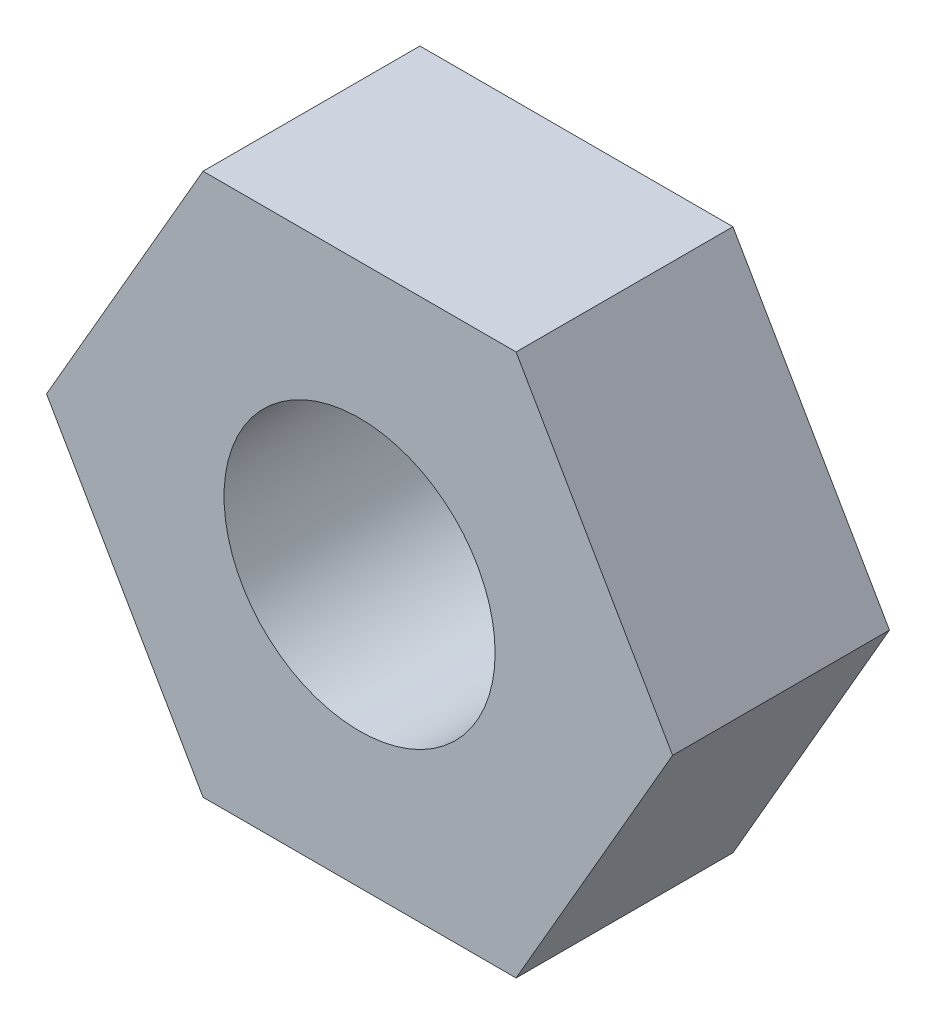
ISO-10303-21;
HEADER;
FILE_DESCRIPTION(('STEP AP214'),'2;1');
FILE_NAME('part.step','',(''),(''),'','','');
FILE_SCHEMA(('AUTOMOTIVE_DESIGN { 1 0 10303 214 1 1 1 1 }'));
ENDSEC;
DATA;
#1=APPLICATION_CONTEXT('core data for automotive mechanical design processes');
#2=APPLICATION_PROTOCOL_DEFINITION('international standard','automotive_design',2000,#1);
#3=PRODUCT_CONTEXT('',#1,'mechanical');
#4=PRODUCT('Part','Part','',(#3));
#5=PRODUCT_RELATED_PRODUCT_CATEGORY('part','',(#4));
#6=PRODUCT_DEFINITION_FORMATION('','',#4);
#7=PRODUCT_DEFINITION_CONTEXT('part definition',#1,'design');
#8=PRODUCT_DEFINITION('design','',#6,#7);
#9=PRODUCT_DEFINITION_SHAPE('','',#8);
#10=(LENGTH_UNIT() NAMED_UNIT(*) SI_UNIT(.MILLI.,.METRE.));
#11=(NAMED_UNIT(*) PLANE_ANGLE_UNIT() SI_UNIT($,.RADIAN.));
#12=(NAMED_UNIT(*) SI_UNIT($,.STERADIAN.) SOLID_ANGLE_UNIT());
#13=UNCERTAINTY_MEASURE_WITH_UNIT(LENGTH_MEASURE(1.E-05),#10,'distance_accuracy_value','');
#14=(GEOMETRIC_REPRESENTATION_CONTEXT(3) GLOBAL_UNCERTAINTY_ASSIGNED_CONTEXT((#13)) GLOBAL_UNIT_ASSIGNED_CONTEXT((#10,
#11,#12)) REPRESENTATION_CONTEXT('',''));
#15=CARTESIAN_POINT('',(0.,0.,0.));
#16=DIRECTION('',(0.,0.,1.));
#17=DIRECTION('',(1.,0.,0.));
#18=AXIS2_PLACEMENT_3D('',#15,#16,#17);
#19=CARTESIAN_POINT('',(0.,0.,1.6));
#20=DIRECTION('',(0.,0.,1.));
#21=DIRECTION('',(1.,0.,0.));
#22=AXIS2_PLACEMENT_3D('',#19,#20,#21);
#23=PLANE('',#22);
#24=DIRECTION('',(0.5,0.866025403784439,0.));
#25=VECTOR('',#24,1.);
#26=CARTESIAN_POINT('',(1.15470053837925,-2.,1.6));
#27=LINE('',#26,#25);
#28=CARTESIAN_POINT('',(1.15470053837925,-2.,1.6));
#29=VERTEX_POINT('',#28);
#30=CARTESIAN_POINT('',(2.3094010767585,0.,1.6));
#31=VERTEX_POINT('',#30);
#32=EDGE_CURVE('E140',#29,#31,#27,.T.);
#33=ORIENTED_EDGE('',*,*,#32,.T.);
#34=DIRECTION('',(-0.5,0.866025403784439,0.));
#35=VECTOR('',#34,1.);
#36=CARTESIAN_POINT('',(2.3094010767585,0.,1.6));
#37=LINE('',#36,#35);
#38=CARTESIAN_POINT('',(1.15470053837925,2.,1.6));
#39=VERTEX_POINT('',#38);
#40=EDGE_CURVE('E93',#31,#39,#37,.T.);
#41=ORIENTED_EDGE('',*,*,#40,.T.);
#42=DIRECTION('',(-1.,0.,0.));
#43=VECTOR('',#42,1.);
#44=CARTESIAN_POINT('',(1.15470053837925,2.,1.6));
#45=LINE('',#44,#43);
#46=CARTESIAN_POINT('',(-1.15470053837925,2.,1.6));
#47=VERTEX_POINT('',#46);
#48=EDGE_CURVE('E108',#39,#47,#45,.T.);
#49=ORIENTED_EDGE('',*,*,#48,.T.);
#50=DIRECTION('',(-0.5,-0.866025403784438,0.));
#51=VECTOR('',#50,1.);
#52=CARTESIAN_POINT('',(-1.15470053837925,2.,1.6));
#53=LINE('',#52,#51);
#54=CARTESIAN_POINT('',(-2.3094010767585,0.,1.6));
#55=VERTEX_POINT('',#54);
#56=EDGE_CURVE('E105',#47,#55,#53,.T.);
#57=ORIENTED_EDGE('',*,*,#56,.T.);
#58=DIRECTION('',(0.5,-0.866025403784439,0.));
#59=VECTOR('',#58,1.);
#60=CARTESIAN_POINT('',(-2.3094010767585,0.,1.6));
#61=LINE('',#60,#59);
#62=CARTESIAN_POINT('',(-1.15470053837925,-2.,1.6));
#63=VERTEX_POINT('',#62);
#64=EDGE_CURVE('E106',#55,#63,#61,.T.);
#65=ORIENTED_EDGE('',*,*,#64,.T.);
#66=DIRECTION('',(1.,0.,0.));
#67=VECTOR('',#66,1.);
#68=CARTESIAN_POINT('',(-1.15470053837925,-2.,1.6));
#69=LINE('',#68,#67);
#70=EDGE_CURVE('E59',#63,#29,#69,.T.);
#71=ORIENTED_EDGE('',*,*,#70,.T.);
#72=EDGE_LOOP('',(#33,#41,#49,#57,#65,#71));
#73=FACE_BOUND('',#72,.T.);
#74=CARTESIAN_POINT('',(0.,0.,1.6));
#75=DIRECTION('',(0.,0.,1.));
#76=DIRECTION('',(1.,0.,0.));
#77=AXIS2_PLACEMENT_3D('',#74,#75,#76);
#78=CIRCLE('',#77,1.);
#79=CARTESIAN_POINT('',(1.,0.,1.6));
#80=VERTEX_POINT('',#79);
#81=EDGE_CURVE('E129',#80,#80,#78,.T.);
#82=ORIENTED_EDGE('',*,*,#81,.F.);
#83=EDGE_LOOP('',(#82));
#84=FACE_BOUND('',#83,.T.);
#85=ADVANCED_FACE('F41',(#73,#84),#23,.T.);
#86=CARTESIAN_POINT('',(0.,0.,0.));
#87=DIRECTION('',(0.,0.,1.));
#88=DIRECTION('',(1.,0.,0.));
#89=AXIS2_PLACEMENT_3D('',#86,#87,#88);
#90=PLANE('',#89);
#91=DIRECTION('',(0.5,0.866025403784439,0.));
#92=VECTOR('',#91,1.);
#93=CARTESIAN_POINT('',(1.15470053837925,-2.,0.));
#94=LINE('',#93,#92);
#95=CARTESIAN_POINT('',(1.15470053837925,-2.,0.));
#96=VERTEX_POINT('',#95);
#97=CARTESIAN_POINT('',(2.3094010767585,0.,0.));
#98=VERTEX_POINT('',#97);
#99=EDGE_CURVE('E126',#96,#98,#94,.T.);
#100=ORIENTED_EDGE('',*,*,#99,.F.);
#101=DIRECTION('',(1.,0.,0.));
#102=VECTOR('',#101,1.);
#103=CARTESIAN_POINT('',(-1.15470053837925,-2.,0.));
#104=LINE('',#103,#102);
#105=CARTESIAN_POINT('',(-1.15470053837925,-2.,0.));
#106=VERTEX_POINT('',#105);
#107=EDGE_CURVE('E89',#106,#96,#104,.T.);
#108=ORIENTED_EDGE('',*,*,#107,.F.);
#109=DIRECTION('',(0.5,-0.866025403784439,0.));
#110=VECTOR('',#109,1.);
#111=CARTESIAN_POINT('',(-2.3094010767585,0.,0.));
#112=LINE('',#111,#110);
#113=CARTESIAN_POINT('',(-2.3094010767585,0.,0.));
#114=VERTEX_POINT('',#113);
#115=EDGE_CURVE('E81',#114,#106,#112,.T.);
#116=ORIENTED_EDGE('',*,*,#115,.F.);
#117=DIRECTION('',(-0.5,-0.866025403784438,0.));
#118=VECTOR('',#117,1.);
#119=CARTESIAN_POINT('',(-1.15470053837925,2.,0.));
#120=LINE('',#119,#118);
#121=CARTESIAN_POINT('',(-1.15470053837925,2.,0.));
#122=VERTEX_POINT('',#121);
#123=EDGE_CURVE('E116',#122,#114,#120,.T.);
#124=ORIENTED_EDGE('',*,*,#123,.F.);
#125=DIRECTION('',(-1.,0.,0.));
#126=VECTOR('',#125,1.);
#127=CARTESIAN_POINT('',(1.15470053837925,2.,0.));
#128=LINE('',#127,#126);
#129=CARTESIAN_POINT('',(1.15470053837925,2.,0.));
#130=VERTEX_POINT('',#129);
#131=EDGE_CURVE('E134',#130,#122,#128,.T.);
#132=ORIENTED_EDGE('',*,*,#131,.F.);
#133=DIRECTION('',(-0.5,0.866025403784439,0.));
#134=VECTOR('',#133,1.);
#135=CARTESIAN_POINT('',(2.3094010767585,0.,0.));
#136=LINE('',#135,#134);
#137=EDGE_CURVE('E128',#98,#130,#136,.T.);
#138=ORIENTED_EDGE('',*,*,#137,.F.);
#139=EDGE_LOOP('',(#100,#108,#116,#124,#132,#138));
#140=FACE_BOUND('',#139,.T.);
#141=CARTESIAN_POINT('',(0.,0.,0.));
#142=DIRECTION('',(0.,0.,1.));
#143=DIRECTION('',(1.,0.,0.));
#144=AXIS2_PLACEMENT_3D('',#141,#142,#143);
#145=CIRCLE('',#144,1.);
#146=CARTESIAN_POINT('',(1.,0.,0.));
#147=VERTEX_POINT('',#146);
#148=EDGE_CURVE('E229',#147,#147,#145,.T.);
#149=ORIENTED_EDGE('',*,*,#148,.T.);
#150=EDGE_LOOP('',(#149));
#151=FACE_BOUND('',#150,.T.);
#152=ADVANCED_FACE('F146',(#140,#151),#90,.F.);
#153=CARTESIAN_POINT('',(1.15470053837925,-2.,1.6));
#154=DIRECTION('',(-0.866025403784439,0.5,0.));
#155=DIRECTION('',(-0.5,-0.866025403784439,0.));
#156=AXIS2_PLACEMENT_3D('',#153,#154,#155);
#157=PLANE('',#156);
#158=ORIENTED_EDGE('',*,*,#99,.T.);
#159=DIRECTION('',(0.,0.,-1.));
#160=VECTOR('',#159,1.);
#161=CARTESIAN_POINT('',(2.3094010767585,0.,1.6));
#162=LINE('',#161,#160);
#163=EDGE_CURVE('E11',#31,#98,#162,.T.);
#164=ORIENTED_EDGE('',*,*,#163,.F.);
#165=ORIENTED_EDGE('',*,*,#32,.F.);
#166=DIRECTION('',(0.,0.,-1.));
#167=VECTOR('',#166,1.);
#168=CARTESIAN_POINT('',(1.15470053837925,-2.,1.6));
#169=LINE('',#168,#167);
#170=EDGE_CURVE('E125',#29,#96,#169,.T.);
#171=ORIENTED_EDGE('',*,*,#170,.T.);
#172=EDGE_LOOP('',(#158,#164,#165,#171));
#173=FACE_BOUND('',#172,.T.);
#174=ADVANCED_FACE('F43',(#173),#157,.F.);
#175=CARTESIAN_POINT('',(2.3094010767585,0.,1.6));
#176=DIRECTION('',(-0.866025403784439,-0.5,0.));
#177=DIRECTION('',(0.5,-0.866025403784439,0.));
#178=AXIS2_PLACEMENT_3D('',#175,#176,#177);
#179=PLANE('',#178);
#180=ORIENTED_EDGE('',*,*,#137,.T.);
#181=DIRECTION('',(0.,0.,-1.));
#182=VECTOR('',#181,1.);
#183=CARTESIAN_POINT('',(1.15470053837925,2.,1.6));
#184=LINE('',#183,#182);
#185=EDGE_CURVE('E49',#39,#130,#184,.T.);
#186=ORIENTED_EDGE('',*,*,#185,.F.);
#187=ORIENTED_EDGE('',*,*,#40,.F.);
#188=ORIENTED_EDGE('',*,*,#163,.T.);
#189=EDGE_LOOP('',(#180,#186,#187,#188));
#190=FACE_BOUND('',#189,.T.);
#191=ADVANCED_FACE('F171',(#190),#179,.F.);
#192=CARTESIAN_POINT('',(1.15470053837925,2.,1.6));
#193=DIRECTION('',(0.,-1.,0.));
#194=DIRECTION('',(0.,0.,-1.));
#195=AXIS2_PLACEMENT_3D('',#192,#193,#194);
#196=PLANE('',#195);
#197=ORIENTED_EDGE('',*,*,#131,.T.);
#198=DIRECTION('',(0.,0.,-1.));
#199=VECTOR('',#198,1.);
#200=CARTESIAN_POINT('',(-1.15470053837925,2.,1.6));
#201=LINE('',#200,#199);
#202=EDGE_CURVE('E120',#47,#122,#201,.T.);
#203=ORIENTED_EDGE('',*,*,#202,.F.);
#204=ORIENTED_EDGE('',*,*,#48,.F.);
#205=ORIENTED_EDGE('',*,*,#185,.T.);
#206=EDGE_LOOP('',(#197,#203,#204,#205));
#207=FACE_BOUND('',#206,.T.);
#208=ADVANCED_FACE('F141',(#207),#196,.F.);
#209=CARTESIAN_POINT('',(-1.15470053837925,2.,1.6));
#210=DIRECTION('',(0.866025403784438,-0.5,0.));
#211=DIRECTION('',(0.5,0.866025403784439,0.));
#212=AXIS2_PLACEMENT_3D('',#209,#210,#211);
#213=PLANE('',#212);
#214=ORIENTED_EDGE('',*,*,#123,.T.);
#215=DIRECTION('',(0.,0.,-1.));
#216=VECTOR('',#215,1.);
#217=CARTESIAN_POINT('',(-2.3094010767585,0.,1.6));
#218=LINE('',#217,#216);
#219=EDGE_CURVE('E113',#55,#114,#218,.T.);
#220=ORIENTED_EDGE('',*,*,#219,.F.);
#221=ORIENTED_EDGE('',*,*,#56,.F.);
#222=ORIENTED_EDGE('',*,*,#202,.T.);
#223=EDGE_LOOP('',(#214,#220,#221,#222));
#224=FACE_BOUND('',#223,.T.);
#225=ADVANCED_FACE('F112',(#224),#213,.F.);
#226=CARTESIAN_POINT('',(-2.3094010767585,0.,1.6));
#227=DIRECTION('',(0.866025403784439,0.5,0.));
#228=DIRECTION('',(-0.5,0.866025403784439,0.));
#229=AXIS2_PLACEMENT_3D('',#226,#227,#228);
#230=PLANE('',#229);
#231=ORIENTED_EDGE('',*,*,#115,.T.);
#232=DIRECTION('',(0.,0.,-1.));
#233=VECTOR('',#232,1.);
#234=CARTESIAN_POINT('',(-1.15470053837925,-2.,1.6));
#235=LINE('',#234,#233);
#236=EDGE_CURVE('E117',#63,#106,#235,.T.);
#237=ORIENTED_EDGE('',*,*,#236,.F.);
#238=ORIENTED_EDGE('',*,*,#64,.F.);
#239=ORIENTED_EDGE('',*,*,#219,.T.);
#240=EDGE_LOOP('',(#231,#237,#238,#239));
#241=FACE_BOUND('',#240,.T.);
#242=ADVANCED_FACE('F119',(#241),#230,.F.);
#243=CARTESIAN_POINT('',(-1.15470053837925,-2.,1.6));
#244=DIRECTION('',(0.,1.,0.));
#245=DIRECTION('',(-1.,0.,0.));
#246=AXIS2_PLACEMENT_3D('',#243,#244,#245);
#247=PLANE('',#246);
#248=ORIENTED_EDGE('',*,*,#107,.T.);
#249=ORIENTED_EDGE('',*,*,#170,.F.);
#250=ORIENTED_EDGE('',*,*,#70,.F.);
#251=ORIENTED_EDGE('',*,*,#236,.T.);
#252=EDGE_LOOP('',(#248,#249,#250,#251));
#253=FACE_BOUND('',#252,.T.);
#254=ADVANCED_FACE('F153',(#253),#247,.F.);
#255=CARTESIAN_POINT('',(0.,0.,1.6));
#256=DIRECTION('',(0.,0.,-1.));
#257=DIRECTION('',(-1.,0.,0.));
#258=AXIS2_PLACEMENT_3D('',#255,#256,#257);
#259=CYLINDRICAL_SURFACE('',#258,1.);
#260=ORIENTED_EDGE('',*,*,#81,.T.);
#261=EDGE_LOOP('',(#260));
#262=FACE_BOUND('',#261,.T.);
#263=ORIENTED_EDGE('',*,*,#148,.F.);
#264=EDGE_LOOP('',(#263));
#265=FACE_BOUND('',#264,.T.);
#266=ADVANCED_FACE('F152',(#262,#265),#259,.F.);
#267=CLOSED_SHELL('',(#85,#152,#174,#191,#208,#225,#242,#254,#266));
#268=MANIFOLD_SOLID_BREP('B2',#267);
#269=ADVANCED_BREP_SHAPE_REPRESENTATION('',(#18,#268),#14);
#270=SHAPE_DEFINITION_REPRESENTATION(#9,#269);
ENDSEC;
END-ISO-10303-21;
